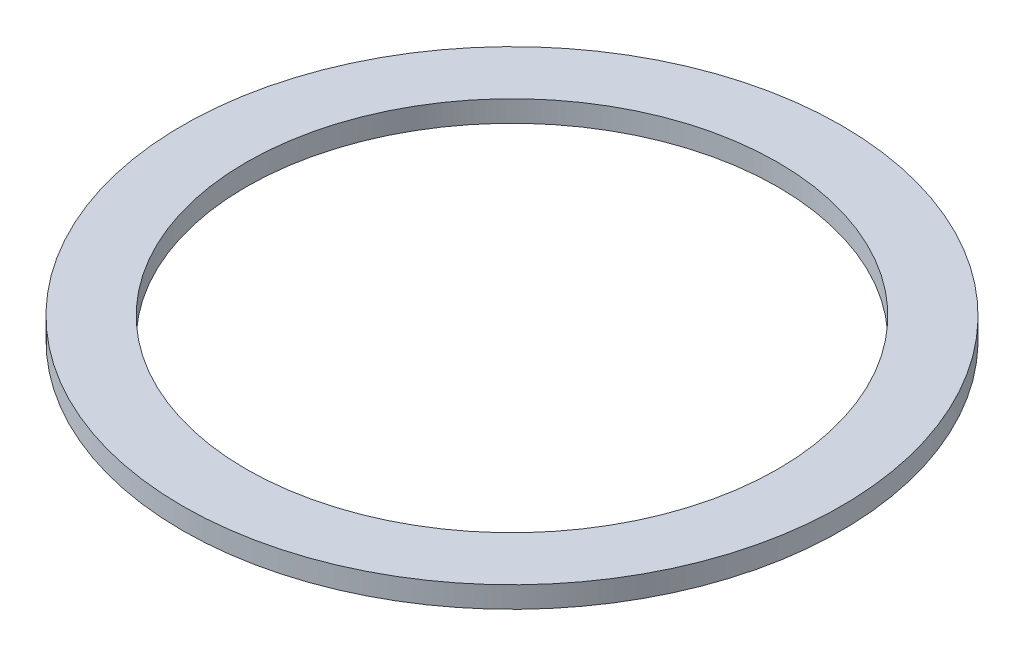
ISO-10303-21;
HEADER;
FILE_DESCRIPTION(('STEP AP214'),'2;1');
FILE_NAME('part.step','',(''),(''),'','','');
FILE_SCHEMA(('AUTOMOTIVE_DESIGN { 1 0 10303 214 1 1 1 1 }'));
ENDSEC;
DATA;
#1=APPLICATION_CONTEXT('core data for automotive mechanical design processes');
#2=APPLICATION_PROTOCOL_DEFINITION('international standard','automotive_design',2000,#1);
#3=PRODUCT_CONTEXT('',#1,'mechanical');
#4=PRODUCT('Part','Part','',(#3));
#5=PRODUCT_RELATED_PRODUCT_CATEGORY('part','',(#4));
#6=PRODUCT_DEFINITION_FORMATION('','',#4);
#7=PRODUCT_DEFINITION_CONTEXT('part definition',#1,'design');
#8=PRODUCT_DEFINITION('design','',#6,#7);
#9=PRODUCT_DEFINITION_SHAPE('','',#8);
#10=(LENGTH_UNIT() NAMED_UNIT(*) SI_UNIT(.MILLI.,.METRE.));
#11=(NAMED_UNIT(*) PLANE_ANGLE_UNIT() SI_UNIT($,.RADIAN.));
#12=(NAMED_UNIT(*) SI_UNIT($,.STERADIAN.) SOLID_ANGLE_UNIT());
#13=UNCERTAINTY_MEASURE_WITH_UNIT(LENGTH_MEASURE(1.E-05),#10,'distance_accuracy_value','');
#14=(GEOMETRIC_REPRESENTATION_CONTEXT(3) GLOBAL_UNCERTAINTY_ASSIGNED_CONTEXT((#13)) GLOBAL_UNIT_ASSIGNED_CONTEXT((#10,
#11,#12)) REPRESENTATION_CONTEXT('',''));
#15=CARTESIAN_POINT('',(0.,0.,0.));
#16=DIRECTION('',(0.,0.,1.));
#17=DIRECTION('',(1.,0.,0.));
#18=AXIS2_PLACEMENT_3D('',#15,#16,#17);
#19=CARTESIAN_POINT('',(0.,2.,0.));
#20=DIRECTION('',(0.,1.,0.));
#21=DIRECTION('',(0.,0.,1.));
#22=AXIS2_PLACEMENT_3D('',#19,#20,#21);
#23=PLANE('',#22);
#24=CARTESIAN_POINT('',(0.,2.,0.));
#25=DIRECTION('',(0.,1.,0.));
#26=DIRECTION('',(0.,0.,1.));
#27=AXIS2_PLACEMENT_3D('',#24,#25,#26);
#28=CIRCLE('',#27,31.);
#29=CARTESIAN_POINT('',(0.,2.,31.));
#30=VERTEX_POINT('',#29);
#31=EDGE_CURVE('E10',#30,#30,#28,.T.);
#32=ORIENTED_EDGE('',*,*,#31,.T.);
#33=EDGE_LOOP('',(#32));
#34=FACE_BOUND('',#33,.T.);
#35=CARTESIAN_POINT('',(0.,2.,0.));
#36=DIRECTION('',(0.,1.,0.));
#37=DIRECTION('',(0.,0.,1.));
#38=AXIS2_PLACEMENT_3D('',#35,#36,#37);
#39=CIRCLE('',#38,25.);
#40=CARTESIAN_POINT('',(0.,2.,25.));
#41=VERTEX_POINT('',#40);
#42=EDGE_CURVE('E45',#41,#41,#39,.T.);
#43=ORIENTED_EDGE('',*,*,#42,.F.);
#44=EDGE_LOOP('',(#43));
#45=FACE_BOUND('',#44,.T.);
#46=ADVANCED_FACE('F34',(#34,#45),#23,.T.);
#47=CARTESIAN_POINT('',(0.,0.,0.));
#48=DIRECTION('',(0.,1.,0.));
#49=DIRECTION('',(0.,0.,1.));
#50=AXIS2_PLACEMENT_3D('',#47,#48,#49);
#51=PLANE('',#50);
#52=CARTESIAN_POINT('',(0.,0.,0.));
#53=DIRECTION('',(0.,1.,0.));
#54=DIRECTION('',(0.,0.,1.));
#55=AXIS2_PLACEMENT_3D('',#52,#53,#54);
#56=CIRCLE('',#55,31.);
#57=CARTESIAN_POINT('',(0.,0.,31.));
#58=VERTEX_POINT('',#57);
#59=EDGE_CURVE('E38',#58,#58,#56,.T.);
#60=ORIENTED_EDGE('',*,*,#59,.F.);
#61=EDGE_LOOP('',(#60));
#62=FACE_BOUND('',#61,.T.);
#63=CARTESIAN_POINT('',(0.,0.,0.));
#64=DIRECTION('',(0.,1.,0.));
#65=DIRECTION('',(0.,0.,1.));
#66=AXIS2_PLACEMENT_3D('',#63,#64,#65);
#67=CIRCLE('',#66,25.);
#68=CARTESIAN_POINT('',(0.,0.,25.));
#69=VERTEX_POINT('',#68);
#70=EDGE_CURVE('E47',#69,#69,#67,.T.);
#71=ORIENTED_EDGE('',*,*,#70,.T.);
#72=EDGE_LOOP('',(#71));
#73=FACE_BOUND('',#72,.T.);
#74=ADVANCED_FACE('F57',(#62,#73),#51,.F.);
#75=CARTESIAN_POINT('',(0.,2.,0.));
#76=DIRECTION('',(0.,-1.,0.));
#77=DIRECTION('',(0.,0.,-1.));
#78=AXIS2_PLACEMENT_3D('',#75,#76,#77);
#79=CYLINDRICAL_SURFACE('',#78,31.);
#80=ORIENTED_EDGE('',*,*,#31,.F.);
#81=EDGE_LOOP('',(#80));
#82=FACE_BOUND('',#81,.T.);
#83=ORIENTED_EDGE('',*,*,#59,.T.);
#84=EDGE_LOOP('',(#83));
#85=FACE_BOUND('',#84,.T.);
#86=ADVANCED_FACE('F36',(#82,#85),#79,.T.);
#87=CARTESIAN_POINT('',(0.,2.,0.));
#88=DIRECTION('',(0.,-1.,0.));
#89=DIRECTION('',(0.,0.,-1.));
#90=AXIS2_PLACEMENT_3D('',#87,#88,#89);
#91=CYLINDRICAL_SURFACE('',#90,25.);
#92=ORIENTED_EDGE('',*,*,#42,.T.);
#93=EDGE_LOOP('',(#92));
#94=FACE_BOUND('',#93,.T.);
#95=ORIENTED_EDGE('',*,*,#70,.F.);
#96=EDGE_LOOP('',(#95));
#97=FACE_BOUND('',#96,.T.);
#98=ADVANCED_FACE('F53',(#94,#97),#91,.F.);
#99=CLOSED_SHELL('',(#46,#74,#86,#98));
#100=MANIFOLD_SOLID_BREP('B2',#99);
#101=ADVANCED_BREP_SHAPE_REPRESENTATION('',(#18,#100),#14);
#102=SHAPE_DEFINITION_REPRESENTATION(#9,#101);
ENDSEC;
END-ISO-10303-21;
